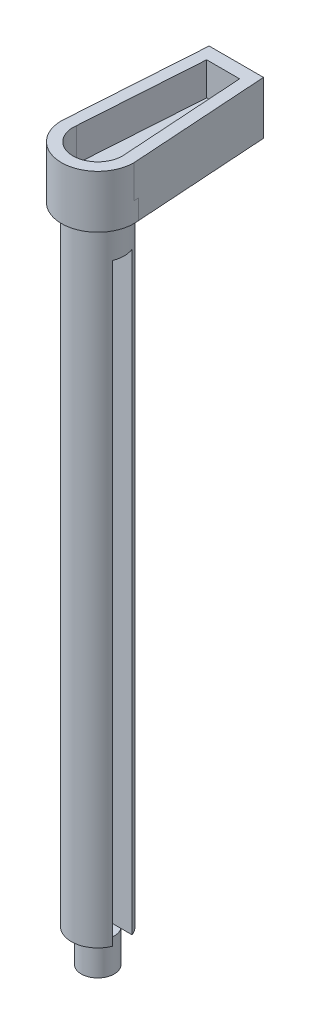
ISO-10303-21;
HEADER;
FILE_DESCRIPTION(('STEP AP214'),'2;1');
FILE_NAME('part.step','',(''),(''),'','','');
FILE_SCHEMA(('AUTOMOTIVE_DESIGN { 1 0 10303 214 1 1 1 1 }'));
ENDSEC;
DATA;
#1=APPLICATION_CONTEXT('core data for automotive mechanical design processes');
#2=APPLICATION_PROTOCOL_DEFINITION('international standard','automotive_design',2000,#1);
#3=PRODUCT_CONTEXT('',#1,'mechanical');
#4=PRODUCT('Part','Part','',(#3));
#5=PRODUCT_RELATED_PRODUCT_CATEGORY('part','',(#4));
#6=PRODUCT_DEFINITION_FORMATION('','',#4);
#7=PRODUCT_DEFINITION_CONTEXT('part definition',#1,'design');
#8=PRODUCT_DEFINITION('design','',#6,#7);
#9=PRODUCT_DEFINITION_SHAPE('','',#8);
#10=(LENGTH_UNIT() NAMED_UNIT(*) SI_UNIT(.MILLI.,.METRE.));
#11=(NAMED_UNIT(*) PLANE_ANGLE_UNIT() SI_UNIT($,.RADIAN.));
#12=(NAMED_UNIT(*) SI_UNIT($,.STERADIAN.) SOLID_ANGLE_UNIT());
#13=UNCERTAINTY_MEASURE_WITH_UNIT(LENGTH_MEASURE(1.E-05),#10,'distance_accuracy_value','');
#14=(GEOMETRIC_REPRESENTATION_CONTEXT(3) GLOBAL_UNCERTAINTY_ASSIGNED_CONTEXT((#13)) GLOBAL_UNIT_ASSIGNED_CONTEXT((#10,
#11,#12)) REPRESENTATION_CONTEXT('',''));
#15=CARTESIAN_POINT('',(0.,0.,0.));
#16=DIRECTION('',(0.,0.,1.));
#17=DIRECTION('',(1.,0.,0.));
#18=AXIS2_PLACEMENT_3D('',#15,#16,#17);
#19=CARTESIAN_POINT('',(0.,53.,0.));
#20=DIRECTION('',(0.,1.,0.));
#21=DIRECTION('',(0.,0.,1.));
#22=AXIS2_PLACEMENT_3D('',#19,#20,#21);
#23=PLANE('',#22);
#24=CARTESIAN_POINT('',(-25.,53.,0.));
#25=DIRECTION('',(0.,1.,0.));
#26=DIRECTION('',(0.,0.,1.));
#27=AXIS2_PLACEMENT_3D('',#24,#25,#26);
#28=CIRCLE('',#27,5.5);
#29=CARTESIAN_POINT('',(-19.5,53.,0.));
#30=VERTEX_POINT('',#29);
#31=CARTESIAN_POINT('',(-19.5474056197207,53.,-0.720565419755219));
#32=VERTEX_POINT('',#31);
#33=EDGE_CURVE('E292',#30,#32,#28,.T.);
#34=ORIENTED_EDGE('',*,*,#33,.T.);
#35=DIRECTION('',(0.0656475574015846,0.,0.997842872504086));
#36=VECTOR('',#35,1.);
#37=CARTESIAN_POINT('',(-19.4159627650405,53.,1.27736597138424));
#38=LINE('',#37,#36);
#39=EDGE_CURVE('E66',#32,#30,#38,.T.);
#40=ORIENTED_EDGE('',*,*,#39,.T.);
#41=EDGE_LOOP('',(#34,#40));
#42=FACE_BOUND('',#41,.T.);
#43=ADVANCED_FACE('F56',(#42),#23,.T.);
#44=CARTESIAN_POINT('',(-30.4525943802793,53.,-0.720565419755183));
#45=VERTEX_POINT('',#44);
#46=CARTESIAN_POINT('',(-30.5,53.,0.));
#47=VERTEX_POINT('',#46);
#48=EDGE_CURVE('E287',#45,#47,#28,.T.);
#49=ORIENTED_EDGE('',*,*,#48,.T.);
#50=DIRECTION('',(0.0656475574015849,0.,-0.997842872504086));
#51=VECTOR('',#50,1.);
#52=CARTESIAN_POINT('',(-30.3685571453198,53.,-1.99793139113947));
#53=LINE('',#52,#51);
#54=EDGE_CURVE('E222',#47,#45,#53,.T.);
#55=ORIENTED_EDGE('',*,*,#54,.T.);
#56=EDGE_LOOP('',(#49,#55));
#57=FACE_BOUND('',#56,.T.);
#58=ADVANCED_FACE('F356',(#57),#23,.T.);
#59=CARTESIAN_POINT('',(-25.,-45.,1.5));
#60=DIRECTION('',(0.,1.,0.));
#61=DIRECTION('',(0.,0.,1.));
#62=AXIS2_PLACEMENT_3D('',#59,#60,#61);
#63=PLANE('',#62);
#64=CARTESIAN_POINT('',(-25.,-45.,0.));
#65=DIRECTION('',(0.,-1.,0.));
#66=DIRECTION('',(0.,0.,-1.));
#67=AXIS2_PLACEMENT_3D('',#64,#65,#66);
#68=CIRCLE('',#67,2.5);
#69=CARTESIAN_POINT('',(-23.,-45.,1.5));
#70=VERTEX_POINT('',#69);
#71=CARTESIAN_POINT('',(-23.,-45.,-1.5));
#72=VERTEX_POINT('',#71);
#73=EDGE_CURVE('E12',#70,#72,#68,.T.);
#74=ORIENTED_EDGE('',*,*,#73,.F.);
#75=DIRECTION('',(1.,0.,0.));
#76=VECTOR('',#75,1.);
#77=CARTESIAN_POINT('',(-25.,-45.,1.5));
#78=LINE('',#77,#76);
#79=CARTESIAN_POINT('',(-21.2919007564522,-45.,1.5));
#80=VERTEX_POINT('',#79);
#81=EDGE_CURVE('E210',#70,#80,#78,.T.);
#82=ORIENTED_EDGE('',*,*,#81,.T.);
#83=CARTESIAN_POINT('',(-25.,-45.,0.));
#84=DIRECTION('',(0.,-1.,0.));
#85=DIRECTION('',(0.,0.,-1.));
#86=AXIS2_PLACEMENT_3D('',#83,#84,#85);
#87=CIRCLE('',#86,4.);
#88=CARTESIAN_POINT('',(-21.2919007564522,-45.,-1.5));
#89=VERTEX_POINT('',#88);
#90=EDGE_CURVE('E179',#80,#89,#87,.T.);
#91=ORIENTED_EDGE('',*,*,#90,.T.);
#92=DIRECTION('',(1.,0.,0.));
#93=VECTOR('',#92,1.);
#94=CARTESIAN_POINT('',(-25.,-45.,-1.5));
#95=LINE('',#94,#93);
#96=EDGE_CURVE('E168',#72,#89,#95,.T.);
#97=ORIENTED_EDGE('',*,*,#96,.F.);
#98=EDGE_LOOP('',(#74,#82,#91,#97));
#99=FACE_BOUND('',#98,.T.);
#100=ADVANCED_FACE('F58',(#99),#63,.F.);
#101=CARTESIAN_POINT('',(-25.,50.,0.));
#102=DIRECTION('',(0.,-1.,0.));
#103=DIRECTION('',(0.,0.,-1.));
#104=AXIS2_PLACEMENT_3D('',#101,#102,#103);
#105=CYLINDRICAL_SURFACE('',#104,4.);
#106=CARTESIAN_POINT('',(-25.,50.,0.));
#107=DIRECTION('',(0.,-1.,0.));
#108=DIRECTION('',(0.,0.,-1.));
#109=AXIS2_PLACEMENT_3D('',#106,#107,#108);
#110=CIRCLE('',#109,4.);
#111=CARTESIAN_POINT('',(-25.,50.,-4.));
#112=VERTEX_POINT('',#111);
#113=EDGE_CURVE('E320',#112,#112,#110,.T.);
#114=ORIENTED_EDGE('',*,*,#113,.T.);
#115=EDGE_LOOP('',(#114));
#116=FACE_BOUND('',#115,.T.);
#117=ORIENTED_EDGE('',*,*,#90,.F.);
#118=DIRECTION('',(0.,-1.,0.));
#119=VECTOR('',#118,1.);
#120=CARTESIAN_POINT('',(-21.2919007564522,50.,1.5));
#121=LINE('',#120,#119);
#122=CARTESIAN_POINT('',(-21.2919007564522,45.,1.5));
#123=VERTEX_POINT('',#122);
#124=EDGE_CURVE('E328',#80,#123,#121,.F.);
#125=ORIENTED_EDGE('',*,*,#124,.T.);
#126=CARTESIAN_POINT('',(-25.,45.,0.));
#127=DIRECTION('',(0.,-1.,0.));
#128=DIRECTION('',(0.,0.,-1.));
#129=AXIS2_PLACEMENT_3D('',#126,#127,#128);
#130=CIRCLE('',#129,4.);
#131=CARTESIAN_POINT('',(-21.2919007564522,45.,-1.5));
#132=VERTEX_POINT('',#131);
#133=EDGE_CURVE('E323',#132,#123,#130,.T.);
#134=ORIENTED_EDGE('',*,*,#133,.F.);
#135=DIRECTION('',(0.,-1.,0.));
#136=VECTOR('',#135,1.);
#137=CARTESIAN_POINT('',(-21.2919007564522,50.,-1.5));
#138=LINE('',#137,#136);
#139=EDGE_CURVE('E60',#89,#132,#138,.F.);
#140=ORIENTED_EDGE('',*,*,#139,.F.);
#141=EDGE_LOOP('',(#117,#125,#134,#140));
#142=FACE_BOUND('',#141,.T.);
#143=ADVANCED_FACE('F336',(#116,#142),#105,.T.);
#144=CARTESIAN_POINT('',(0.,50.,0.));
#145=DIRECTION('',(0.,1.,0.));
#146=DIRECTION('',(0.,0.,1.));
#147=AXIS2_PLACEMENT_3D('',#144,#145,#146);
#148=PLANE('',#147);
#149=ORIENTED_EDGE('',*,*,#113,.F.);
#150=EDGE_LOOP('',(#149));
#151=FACE_BOUND('',#150,.T.);
#152=DIRECTION('',(0.0656475574015846,0.,0.997842872504086));
#153=VECTOR('',#152,1.);
#154=CARTESIAN_POINT('',(-19.4159627650405,50.,1.27736597138424));
#155=LINE('',#154,#153);
#156=CARTESIAN_POINT('',(-20.8815789473684,50.,-21.));
#157=VERTEX_POINT('',#156);
#158=CARTESIAN_POINT('',(-19.5474056197207,50.,-0.720565419755218));
#159=VERTEX_POINT('',#158);
#160=EDGE_CURVE('E298',#157,#159,#155,.T.);
#161=ORIENTED_EDGE('',*,*,#160,.T.);
#162=CARTESIAN_POINT('',(-25.,50.,0.));
#163=DIRECTION('',(0.,1.,0.));
#164=DIRECTION('',(0.,0.,1.));
#165=AXIS2_PLACEMENT_3D('',#162,#163,#164);
#166=CIRCLE('',#165,5.5);
#167=CARTESIAN_POINT('',(-30.4525943802793,50.,-0.720565419755204));
#168=VERTEX_POINT('',#167);
#169=EDGE_CURVE('E295',#168,#159,#166,.T.);
#170=ORIENTED_EDGE('',*,*,#169,.F.);
#171=DIRECTION('',(0.0656475574015846,0.,-0.997842872504086));
#172=VECTOR('',#171,1.);
#173=CARTESIAN_POINT('',(-30.3685571453198,50.,-1.99793139113946));
#174=LINE('',#173,#172);
#175=CARTESIAN_POINT('',(-29.1184210526316,50.,-21.));
#176=VERTEX_POINT('',#175);
#177=EDGE_CURVE('E272',#168,#176,#174,.T.);
#178=ORIENTED_EDGE('',*,*,#177,.T.);
#179=DIRECTION('',(1.,0.,0.));
#180=VECTOR('',#179,1.);
#181=CARTESIAN_POINT('',(0.,50.,-21.));
#182=LINE('',#181,#180);
#183=EDGE_CURVE('E302',#176,#157,#182,.T.);
#184=ORIENTED_EDGE('',*,*,#183,.T.);
#185=EDGE_LOOP('',(#161,#170,#178,#184));
#186=FACE_BOUND('',#185,.T.);
#187=ADVANCED_FACE('F419',(#151,#186),#148,.F.);
#188=CARTESIAN_POINT('',(-25.,53.,0.));
#189=DIRECTION('',(0.,-1.,0.));
#190=DIRECTION('',(0.,0.,-1.));
#191=AXIS2_PLACEMENT_3D('',#188,#189,#190);
#192=CYLINDRICAL_SURFACE('',#191,5.5);
#193=ORIENTED_EDGE('',*,*,#169,.T.);
#194=DIRECTION('',(0.,-1.,0.));
#195=VECTOR('',#194,1.);
#196=CARTESIAN_POINT('',(-19.5474056197207,53.,-0.720565419755204));
#197=LINE('',#196,#195);
#198=EDGE_CURVE('E312',#32,#159,#197,.T.);
#199=ORIENTED_EDGE('',*,*,#198,.F.);
#200=ORIENTED_EDGE('',*,*,#33,.F.);
#201=DIRECTION('',(0.,-1.,0.));
#202=VECTOR('',#201,1.);
#203=CARTESIAN_POINT('',(-19.5,58.,0.));
#204=LINE('',#203,#202);
#205=CARTESIAN_POINT('',(-19.5,58.,0.));
#206=VERTEX_POINT('',#205);
#207=EDGE_CURVE('E265',#206,#30,#204,.T.);
#208=ORIENTED_EDGE('',*,*,#207,.F.);
#209=CARTESIAN_POINT('',(-25.,58.,0.));
#210=DIRECTION('',(0.,1.,0.));
#211=DIRECTION('',(0.,0.,1.));
#212=AXIS2_PLACEMENT_3D('',#209,#210,#211);
#213=CIRCLE('',#212,5.5);
#214=CARTESIAN_POINT('',(-30.5,58.,0.));
#215=VERTEX_POINT('',#214);
#216=EDGE_CURVE('E239',#215,#206,#213,.T.);
#217=ORIENTED_EDGE('',*,*,#216,.F.);
#218=DIRECTION('',(0.,-1.,0.));
#219=VECTOR('',#218,1.);
#220=CARTESIAN_POINT('',(-30.5,58.,0.));
#221=LINE('',#220,#219);
#222=EDGE_CURVE('E268',#215,#47,#221,.T.);
#223=ORIENTED_EDGE('',*,*,#222,.T.);
#224=ORIENTED_EDGE('',*,*,#48,.F.);
#225=DIRECTION('',(0.,-1.,0.));
#226=VECTOR('',#225,1.);
#227=CARTESIAN_POINT('',(-30.4525943802793,53.,-0.720565419755204));
#228=LINE('',#227,#226);
#229=EDGE_CURVE('E316',#168,#45,#228,.F.);
#230=ORIENTED_EDGE('',*,*,#229,.F.);
#231=EDGE_LOOP('',(#193,#199,#200,#208,#217,#223,#224,#230));
#232=FACE_BOUND('',#231,.T.);
#233=ADVANCED_FACE('F416',(#232),#192,.T.);
#234=CARTESIAN_POINT('',(-19.4159627650405,53.,1.27736597138424));
#235=DIRECTION('',(0.997842872504086,0.,-0.0656475574015846));
#236=DIRECTION('',(-0.0656475574015846,0.,-0.997842872504086));
#237=AXIS2_PLACEMENT_3D('',#234,#235,#236);
#238=PLANE('',#237);
#239=DIRECTION('',(0.,-1.,0.));
#240=VECTOR('',#239,1.);
#241=CARTESIAN_POINT('',(-20.8815789473684,53.,-21.));
#242=LINE('',#241,#240);
#243=CARTESIAN_POINT('',(-20.8815789473684,58.,-21.));
#244=VERTEX_POINT('',#243);
#245=EDGE_CURVE('E309',#244,#157,#242,.T.);
#246=ORIENTED_EDGE('',*,*,#245,.F.);
#247=DIRECTION('',(0.0656475574015846,0.,0.997842872504086));
#248=VECTOR('',#247,1.);
#249=CARTESIAN_POINT('',(-19.4159627650405,58.,1.27736597138424));
#250=LINE('',#249,#248);
#251=EDGE_CURVE('E242',#244,#206,#250,.T.);
#252=ORIENTED_EDGE('',*,*,#251,.T.);
#253=ORIENTED_EDGE('',*,*,#207,.T.);
#254=ORIENTED_EDGE('',*,*,#39,.F.);
#255=ORIENTED_EDGE('',*,*,#198,.T.);
#256=ORIENTED_EDGE('',*,*,#160,.F.);
#257=EDGE_LOOP('',(#246,#252,#253,#254,#255,#256));
#258=FACE_BOUND('',#257,.T.);
#259=ADVANCED_FACE('F411',(#258),#238,.T.);
#260=CARTESIAN_POINT('',(0.,53.,-21.));
#261=DIRECTION('',(0.,0.,-1.));
#262=DIRECTION('',(-1.,0.,0.));
#263=AXIS2_PLACEMENT_3D('',#260,#261,#262);
#264=PLANE('',#263);
#265=ORIENTED_EDGE('',*,*,#183,.F.);
#266=DIRECTION('',(0.,-1.,0.));
#267=VECTOR('',#266,1.);
#268=CARTESIAN_POINT('',(-29.1184210526316,53.,-21.));
#269=LINE('',#268,#267);
#270=CARTESIAN_POINT('',(-29.1184210526316,58.,-21.));
#271=VERTEX_POINT('',#270);
#272=EDGE_CURVE('E291',#271,#176,#269,.T.);
#273=ORIENTED_EDGE('',*,*,#272,.F.);
#274=DIRECTION('',(-1.,0.,0.));
#275=VECTOR('',#274,1.);
#276=CARTESIAN_POINT('',(0.,58.,-21.));
#277=LINE('',#276,#275);
#278=EDGE_CURVE('E231',#244,#271,#277,.T.);
#279=ORIENTED_EDGE('',*,*,#278,.F.);
#280=ORIENTED_EDGE('',*,*,#245,.T.);
#281=EDGE_LOOP('',(#265,#273,#279,#280));
#282=FACE_BOUND('',#281,.T.);
#283=ADVANCED_FACE('F398',(#282),#264,.T.);
#284=CARTESIAN_POINT('',(-30.3685571453198,53.,-1.99793139113946));
#285=DIRECTION('',(-0.997842872504086,0.,-0.0656475574015846));
#286=DIRECTION('',(-0.0656475574015846,0.,0.997842872504086));
#287=AXIS2_PLACEMENT_3D('',#284,#285,#286);
#288=PLANE('',#287);
#289=ORIENTED_EDGE('',*,*,#177,.F.);
#290=ORIENTED_EDGE('',*,*,#229,.T.);
#291=ORIENTED_EDGE('',*,*,#54,.F.);
#292=ORIENTED_EDGE('',*,*,#222,.F.);
#293=DIRECTION('',(0.0656475574015849,0.,-0.997842872504086));
#294=VECTOR('',#293,1.);
#295=CARTESIAN_POINT('',(-30.3685571453198,58.,-1.99793139113947));
#296=LINE('',#295,#294);
#297=EDGE_CURVE('E235',#215,#271,#296,.T.);
#298=ORIENTED_EDGE('',*,*,#297,.T.);
#299=ORIENTED_EDGE('',*,*,#272,.T.);
#300=EDGE_LOOP('',(#289,#290,#291,#292,#298,#299));
#301=FACE_BOUND('',#300,.T.);
#302=ADVANCED_FACE('F393',(#301),#288,.T.);
#303=CARTESIAN_POINT('',(-28.6260989484572,58.,-1.88329598345114));
#304=DIRECTION('',(-0.997842872504086,0.,-0.0656475574015849));
#305=DIRECTION('',(-0.0656475574015849,0.,0.997842872504086));
#306=AXIS2_PLACEMENT_3D('',#303,#304,#305);
#307=PLANE('',#306);
#308=DIRECTION('',(0.0656475574015849,0.,-0.997842872504086));
#309=VECTOR('',#308,1.);
#310=CARTESIAN_POINT('',(-28.6260989484572,53.,-1.88329598345114));
#311=LINE('',#310,#309);
#312=CARTESIAN_POINT('',(-28.717677986554,53.,-0.491294604378561));
#313=VERTEX_POINT('',#312);
#314=CARTESIAN_POINT('',(-27.5,53.,-19.));
#315=VERTEX_POINT('',#314);
#316=EDGE_CURVE('E81',#313,#315,#311,.T.);
#317=ORIENTED_EDGE('',*,*,#316,.T.);
#318=DIRECTION('',(0.,-1.,0.));
#319=VECTOR('',#318,1.);
#320=CARTESIAN_POINT('',(-27.5,58.,-19.));
#321=LINE('',#320,#319);
#322=CARTESIAN_POINT('',(-27.5,58.,-19.));
#323=VERTEX_POINT('',#322);
#324=EDGE_CURVE('E269',#323,#315,#321,.T.);
#325=ORIENTED_EDGE('',*,*,#324,.F.);
#326=DIRECTION('',(0.0656475574015849,0.,-0.997842872504086));
#327=VECTOR('',#326,1.);
#328=CARTESIAN_POINT('',(-28.6260989484572,58.,-1.88329598345114));
#329=LINE('',#328,#327);
#330=CARTESIAN_POINT('',(-28.717677986554,58.,-0.491294604378561));
#331=VERTEX_POINT('',#330);
#332=EDGE_CURVE('E217',#331,#323,#329,.T.);
#333=ORIENTED_EDGE('',*,*,#332,.F.);
#334=DIRECTION('',(0.,-1.,0.));
#335=VECTOR('',#334,1.);
#336=CARTESIAN_POINT('',(-28.717677986554,58.,-0.491294604378561));
#337=LINE('',#336,#335);
#338=EDGE_CURVE('E246',#331,#313,#337,.T.);
#339=ORIENTED_EDGE('',*,*,#338,.T.);
#340=EDGE_LOOP('',(#317,#325,#333,#339));
#341=FACE_BOUND('',#340,.T.);
#342=ADVANCED_FACE('F390',(#341),#307,.F.);
#343=CARTESIAN_POINT('',(0.,58.,-19.));
#344=DIRECTION('',(0.,0.,-1.));
#345=DIRECTION('',(-1.,0.,0.));
#346=AXIS2_PLACEMENT_3D('',#343,#344,#345);
#347=PLANE('',#346);
#348=DIRECTION('',(1.,0.,0.));
#349=VECTOR('',#348,1.);
#350=CARTESIAN_POINT('',(0.,53.,-19.));
#351=LINE('',#350,#349);
#352=CARTESIAN_POINT('',(-22.5,53.,-19.));
#353=VERTEX_POINT('',#352);
#354=EDGE_CURVE('E249',#315,#353,#351,.T.);
#355=ORIENTED_EDGE('',*,*,#354,.T.);
#356=DIRECTION('',(0.,-1.,0.));
#357=VECTOR('',#356,1.);
#358=CARTESIAN_POINT('',(-22.5,58.,-19.));
#359=LINE('',#358,#357);
#360=CARTESIAN_POINT('',(-22.5,58.,-19.));
#361=VERTEX_POINT('',#360);
#362=EDGE_CURVE('E280',#361,#353,#359,.T.);
#363=ORIENTED_EDGE('',*,*,#362,.F.);
#364=DIRECTION('',(1.,0.,0.));
#365=VECTOR('',#364,1.);
#366=CARTESIAN_POINT('',(0.,58.,-19.));
#367=LINE('',#366,#365);
#368=EDGE_CURVE('E221',#323,#361,#367,.T.);
#369=ORIENTED_EDGE('',*,*,#368,.F.);
#370=ORIENTED_EDGE('',*,*,#324,.T.);
#371=EDGE_LOOP('',(#355,#363,#369,#370));
#372=FACE_BOUND('',#371,.T.);
#373=ADVANCED_FACE('F387',(#372),#347,.F.);
#374=CARTESIAN_POINT('',(-21.1584209619031,58.,1.39200137907258));
#375=DIRECTION('',(0.997842872504086,0.,-0.0656475574015847));
#376=DIRECTION('',(-0.0656475574015847,0.,-0.997842872504086));
#377=AXIS2_PLACEMENT_3D('',#374,#375,#376);
#378=PLANE('',#377);
#379=DIRECTION('',(0.0656475574015847,0.,0.997842872504086));
#380=VECTOR('',#379,1.);
#381=CARTESIAN_POINT('',(-21.1584209619031,53.,1.39200137907258));
#382=LINE('',#381,#380);
#383=CARTESIAN_POINT('',(-21.282322013446,53.,-0.491294604378598));
#384=VERTEX_POINT('',#383);
#385=EDGE_CURVE('E253',#353,#384,#382,.T.);
#386=ORIENTED_EDGE('',*,*,#385,.T.);
#387=DIRECTION('',(0.,-1.,0.));
#388=VECTOR('',#387,1.);
#389=CARTESIAN_POINT('',(-21.282322013446,58.,-0.491294604378598));
#390=LINE('',#389,#388);
#391=CARTESIAN_POINT('',(-21.282322013446,58.,-0.491294604378598));
#392=VERTEX_POINT('',#391);
#393=EDGE_CURVE('E276',#392,#384,#390,.T.);
#394=ORIENTED_EDGE('',*,*,#393,.F.);
#395=DIRECTION('',(0.0656475574015847,0.,0.997842872504086));
#396=VECTOR('',#395,1.);
#397=CARTESIAN_POINT('',(-21.1584209619031,58.,1.39200137907258));
#398=LINE('',#397,#396);
#399=EDGE_CURVE('E225',#361,#392,#398,.T.);
#400=ORIENTED_EDGE('',*,*,#399,.F.);
#401=ORIENTED_EDGE('',*,*,#362,.T.);
#402=EDGE_LOOP('',(#386,#394,#400,#401));
#403=FACE_BOUND('',#402,.T.);
#404=ADVANCED_FACE('F380',(#403),#378,.F.);
#405=CARTESIAN_POINT('',(-25.,58.,0.));
#406=DIRECTION('',(0.,-1.,0.));
#407=DIRECTION('',(0.,0.,-1.));
#408=AXIS2_PLACEMENT_3D('',#405,#406,#407);
#409=CYLINDRICAL_SURFACE('',#408,3.75);
#410=CARTESIAN_POINT('',(-25.,53.,0.));
#411=DIRECTION('',(0.,1.,0.));
#412=DIRECTION('',(0.,0.,1.));
#413=AXIS2_PLACEMENT_3D('',#410,#411,#412);
#414=CIRCLE('',#413,3.75);
#415=EDGE_CURVE('E257',#384,#313,#414,.F.);
#416=ORIENTED_EDGE('',*,*,#415,.T.);
#417=ORIENTED_EDGE('',*,*,#338,.F.);
#418=CARTESIAN_POINT('',(-25.,58.,0.));
#419=DIRECTION('',(0.,1.,0.));
#420=DIRECTION('',(0.,0.,1.));
#421=AXIS2_PLACEMENT_3D('',#418,#419,#420);
#422=CIRCLE('',#421,3.75);
#423=EDGE_CURVE('E228',#392,#331,#422,.F.);
#424=ORIENTED_EDGE('',*,*,#423,.F.);
#425=ORIENTED_EDGE('',*,*,#393,.T.);
#426=EDGE_LOOP('',(#416,#417,#424,#425));
#427=FACE_BOUND('',#426,.T.);
#428=ADVANCED_FACE('F374',(#427),#409,.F.);
#429=CARTESIAN_POINT('',(0.,58.,0.));
#430=DIRECTION('',(0.,1.,0.));
#431=DIRECTION('',(0.,0.,1.));
#432=AXIS2_PLACEMENT_3D('',#429,#430,#431);
#433=PLANE('',#432);
#434=ORIENTED_EDGE('',*,*,#332,.T.);
#435=ORIENTED_EDGE('',*,*,#368,.T.);
#436=ORIENTED_EDGE('',*,*,#399,.T.);
#437=ORIENTED_EDGE('',*,*,#423,.T.);
#438=EDGE_LOOP('',(#434,#435,#436,#437));
#439=FACE_BOUND('',#438,.T.);
#440=ORIENTED_EDGE('',*,*,#278,.T.);
#441=ORIENTED_EDGE('',*,*,#297,.F.);
#442=ORIENTED_EDGE('',*,*,#216,.T.);
#443=ORIENTED_EDGE('',*,*,#251,.F.);
#444=EDGE_LOOP('',(#440,#441,#442,#443));
#445=FACE_BOUND('',#444,.T.);
#446=ADVANCED_FACE('F368',(#439,#445),#433,.T.);
#447=ORIENTED_EDGE('',*,*,#316,.F.);
#448=ORIENTED_EDGE('',*,*,#415,.F.);
#449=ORIENTED_EDGE('',*,*,#385,.F.);
#450=ORIENTED_EDGE('',*,*,#354,.F.);
#451=EDGE_LOOP('',(#447,#448,#449,#450));
#452=FACE_BOUND('',#451,.T.);
#453=ADVANCED_FACE('F359',(#452),#23,.T.);
#454=CARTESIAN_POINT('',(-25.,45.,-1.5));
#455=DIRECTION('',(0.,0.,-1.));
#456=DIRECTION('',(-1.,0.,0.));
#457=AXIS2_PLACEMENT_3D('',#454,#455,#456);
#458=PLANE('',#457);
#459=ORIENTED_EDGE('',*,*,#139,.T.);
#460=DIRECTION('',(1.,0.,0.));
#461=VECTOR('',#460,1.);
#462=CARTESIAN_POINT('',(-25.,45.,-1.5));
#463=LINE('',#462,#461);
#464=CARTESIAN_POINT('',(-25.,45.,-1.5));
#465=VERTEX_POINT('',#464);
#466=EDGE_CURVE('E206',#465,#132,#463,.T.);
#467=ORIENTED_EDGE('',*,*,#466,.F.);
#468=DIRECTION('',(0.,1.,0.));
#469=VECTOR('',#468,1.);
#470=CARTESIAN_POINT('',(-25.,45.,-1.5));
#471=LINE('',#470,#469);
#472=CARTESIAN_POINT('',(-25.,-45.,-1.5));
#473=VERTEX_POINT('',#472);
#474=EDGE_CURVE('E171',#473,#465,#471,.T.);
#475=ORIENTED_EDGE('',*,*,#474,.F.);
#476=EDGE_CURVE('E165',#473,#72,#95,.T.);
#477=ORIENTED_EDGE('',*,*,#476,.T.);
#478=ORIENTED_EDGE('',*,*,#96,.T.);
#479=EDGE_LOOP('',(#459,#467,#475,#477,#478));
#480=FACE_BOUND('',#479,.T.);
#481=ADVANCED_FACE('F167',(#480),#458,.F.);
#482=CARTESIAN_POINT('',(-25.,45.,1.5));
#483=DIRECTION('',(0.,0.,1.));
#484=DIRECTION('',(1.,0.,0.));
#485=AXIS2_PLACEMENT_3D('',#482,#483,#484);
#486=PLANE('',#485);
#487=ORIENTED_EDGE('',*,*,#124,.F.);
#488=ORIENTED_EDGE('',*,*,#81,.F.);
#489=CARTESIAN_POINT('',(-25.,-45.,1.5));
#490=VERTEX_POINT('',#489);
#491=EDGE_CURVE('E182',#490,#70,#78,.T.);
#492=ORIENTED_EDGE('',*,*,#491,.F.);
#493=DIRECTION('',(0.,-1.,0.));
#494=VECTOR('',#493,1.);
#495=CARTESIAN_POINT('',(-25.,45.,1.5));
#496=LINE('',#495,#494);
#497=CARTESIAN_POINT('',(-25.,45.,1.5));
#498=VERTEX_POINT('',#497);
#499=EDGE_CURVE('E200',#498,#490,#496,.T.);
#500=ORIENTED_EDGE('',*,*,#499,.F.);
#501=DIRECTION('',(1.,0.,0.));
#502=VECTOR('',#501,1.);
#503=CARTESIAN_POINT('',(-25.,45.,1.5));
#504=LINE('',#503,#502);
#505=EDGE_CURVE('E211',#498,#123,#504,.T.);
#506=ORIENTED_EDGE('',*,*,#505,.T.);
#507=EDGE_LOOP('',(#487,#488,#492,#500,#506));
#508=FACE_BOUND('',#507,.T.);
#509=ADVANCED_FACE('F341',(#508),#486,.F.);
#510=CARTESIAN_POINT('',(-25.,45.,1.5));
#511=DIRECTION('',(0.,1.,0.));
#512=DIRECTION('',(0.,0.,1.));
#513=AXIS2_PLACEMENT_3D('',#510,#511,#512);
#514=PLANE('',#513);
#515=ORIENTED_EDGE('',*,*,#133,.T.);
#516=ORIENTED_EDGE('',*,*,#505,.F.);
#517=DIRECTION('',(0.,0.,1.));
#518=VECTOR('',#517,1.);
#519=CARTESIAN_POINT('',(-25.,45.,1.5));
#520=LINE('',#519,#518);
#521=EDGE_CURVE('E196',#465,#498,#520,.T.);
#522=ORIENTED_EDGE('',*,*,#521,.F.);
#523=ORIENTED_EDGE('',*,*,#466,.T.);
#524=EDGE_LOOP('',(#515,#516,#522,#523));
#525=FACE_BOUND('',#524,.T.);
#526=ADVANCED_FACE('F338',(#525),#514,.F.);
#527=CARTESIAN_POINT('',(-25.,0.,0.));
#528=DIRECTION('',(1.,0.,0.));
#529=DIRECTION('',(0.,0.,-1.));
#530=AXIS2_PLACEMENT_3D('',#527,#528,#529);
#531=PLANE('',#530);
#532=ORIENTED_EDGE('',*,*,#474,.T.);
#533=ORIENTED_EDGE('',*,*,#521,.T.);
#534=ORIENTED_EDGE('',*,*,#499,.T.);
#535=DIRECTION('',(0.,0.,-1.));
#536=VECTOR('',#535,1.);
#537=CARTESIAN_POINT('',(-25.,-45.,1.5));
#538=LINE('',#537,#536);
#539=EDGE_CURVE('E204',#490,#473,#538,.T.);
#540=ORIENTED_EDGE('',*,*,#539,.T.);
#541=EDGE_LOOP('',(#532,#533,#534,#540));
#542=FACE_BOUND('',#541,.T.);
#543=ADVANCED_FACE('F343',(#542),#531,.T.);
#544=CARTESIAN_POINT('',(-25.,-50.,0.));
#545=DIRECTION('',(0.,1.,0.));
#546=DIRECTION('',(0.,0.,1.));
#547=AXIS2_PLACEMENT_3D('',#544,#545,#546);
#548=CYLINDRICAL_SURFACE('',#547,2.5);
#549=CARTESIAN_POINT('',(-25.,-50.,0.));
#550=DIRECTION('',(0.,-1.,0.));
#551=DIRECTION('',(0.,0.,-1.));
#552=AXIS2_PLACEMENT_3D('',#549,#550,#551);
#553=CIRCLE('',#552,2.5);
#554=CARTESIAN_POINT('',(-25.,-50.,-2.5));
#555=VERTEX_POINT('',#554);
#556=EDGE_CURVE('E189',#555,#555,#553,.T.);
#557=ORIENTED_EDGE('',*,*,#556,.F.);
#558=EDGE_LOOP('',(#557));
#559=FACE_BOUND('',#558,.T.);
#560=EDGE_CURVE('E68',#72,#70,#68,.T.);
#561=ORIENTED_EDGE('',*,*,#560,.T.);
#562=ORIENTED_EDGE('',*,*,#73,.T.);
#563=EDGE_LOOP('',(#561,#562));
#564=FACE_BOUND('',#563,.T.);
#565=ADVANCED_FACE('F185',(#559,#564),#548,.T.);
#566=CARTESIAN_POINT('',(-25.,-50.,0.));
#567=DIRECTION('',(0.,-1.,0.));
#568=DIRECTION('',(0.,0.,-1.));
#569=AXIS2_PLACEMENT_3D('',#566,#567,#568);
#570=PLANE('',#569);
#571=ORIENTED_EDGE('',*,*,#556,.T.);
#572=EDGE_LOOP('',(#571));
#573=FACE_BOUND('',#572,.T.);
#574=ADVANCED_FACE('F350',(#573),#570,.T.);
#575=CARTESIAN_POINT('',(-25.,-45.,0.));
#576=DIRECTION('',(0.,-1.,0.));
#577=DIRECTION('',(0.,0.,-1.));
#578=AXIS2_PLACEMENT_3D('',#575,#576,#577);
#579=PLANE('',#578);
#580=ORIENTED_EDGE('',*,*,#476,.F.);
#581=ORIENTED_EDGE('',*,*,#539,.F.);
#582=ORIENTED_EDGE('',*,*,#491,.T.);
#583=ORIENTED_EDGE('',*,*,#560,.F.);
#584=EDGE_LOOP('',(#580,#581,#582,#583));
#585=FACE_BOUND('',#584,.T.);
#586=ADVANCED_FACE('F187',(#585),#579,.F.);
#587=CLOSED_SHELL('',(#43,#58,#100,#143,#187,#233,#259,#283,#302,#342,#373,#404,#428,#446,#453,
#481,#509,#526,#543,#565,#574,#586));
#588=MANIFOLD_SOLID_BREP('B2',#587);
#589=ADVANCED_BREP_SHAPE_REPRESENTATION('',(#18,#588),#14);
#590=SHAPE_DEFINITION_REPRESENTATION(#9,#589);
ENDSEC;
END-ISO-10303-21;
